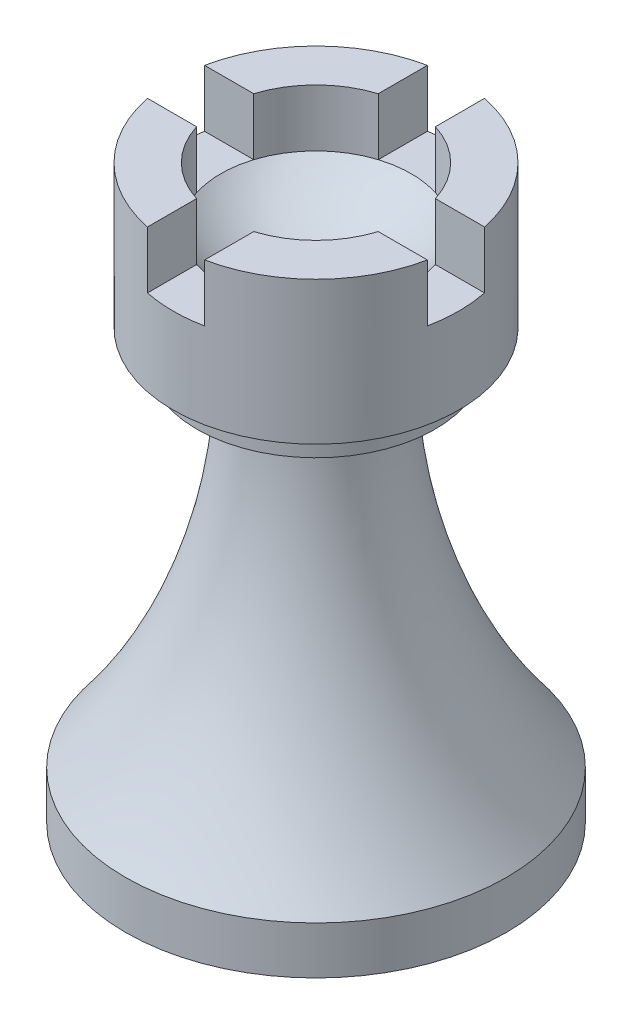
ISO-10303-21;
HEADER;
FILE_DESCRIPTION(('STEP AP214'),'2;1');
FILE_NAME('part.step','',(''),(''),'','','');
FILE_SCHEMA(('AUTOMOTIVE_DESIGN { 1 0 10303 214 1 1 1 1 }'));
ENDSEC;
DATA;
#1=APPLICATION_CONTEXT('core data for automotive mechanical design processes');
#2=APPLICATION_PROTOCOL_DEFINITION('international standard','automotive_design',2000,#1);
#3=PRODUCT_CONTEXT('',#1,'mechanical');
#4=PRODUCT('Part','Part','',(#3));
#5=PRODUCT_RELATED_PRODUCT_CATEGORY('part','',(#4));
#6=PRODUCT_DEFINITION_FORMATION('','',#4);
#7=PRODUCT_DEFINITION_CONTEXT('part definition',#1,'design');
#8=PRODUCT_DEFINITION('design','',#6,#7);
#9=PRODUCT_DEFINITION_SHAPE('','',#8);
#10=(LENGTH_UNIT() NAMED_UNIT(*) SI_UNIT(.MILLI.,.METRE.));
#11=(NAMED_UNIT(*) PLANE_ANGLE_UNIT() SI_UNIT($,.RADIAN.));
#12=(NAMED_UNIT(*) SI_UNIT($,.STERADIAN.) SOLID_ANGLE_UNIT());
#13=UNCERTAINTY_MEASURE_WITH_UNIT(LENGTH_MEASURE(1.E-05),#10,'distance_accuracy_value','');
#14=(GEOMETRIC_REPRESENTATION_CONTEXT(3) GLOBAL_UNCERTAINTY_ASSIGNED_CONTEXT((#13)) GLOBAL_UNIT_ASSIGNED_CONTEXT((#10,
#11,#12)) REPRESENTATION_CONTEXT('',''));
#15=CARTESIAN_POINT('',(0.,0.,0.));
#16=DIRECTION('',(0.,0.,1.));
#17=DIRECTION('',(1.,0.,0.));
#18=AXIS2_PLACEMENT_3D('',#15,#16,#17);
#19=CARTESIAN_POINT('',(0.,27.9733746130031,0.));
#20=DIRECTION('',(0.,1.,0.));
#21=DIRECTION('',(0.,0.,1.));
#22=AXIS2_PLACEMENT_3D('',#19,#20,#21);
#23=CYLINDRICAL_SURFACE('',#22,6.);
#24=CARTESIAN_POINT('',(0.,10.8,0.));
#25=DIRECTION('',(0.,1.,0.));
#26=DIRECTION('',(0.,0.,1.));
#27=AXIS2_PLACEMENT_3D('',#24,#25,#26);
#28=CIRCLE('',#27,6.);
#29=CARTESIAN_POINT('',(1.8,10.8,5.72363520850167));
#30=VERTEX_POINT('',#29);
#31=CARTESIAN_POINT('',(5.72363520850169,10.8,1.79999999999994));
#32=VERTEX_POINT('',#31);
#33=EDGE_CURVE('E195',#30,#32,#28,.T.);
#34=ORIENTED_EDGE('',*,*,#33,.T.);
#35=DIRECTION('',(0.,1.,0.));
#36=VECTOR('',#35,1.);
#37=CARTESIAN_POINT('',(5.72363520850169,27.9733746130031,1.79999999999994));
#38=LINE('',#37,#36);
#39=CARTESIAN_POINT('',(5.72363520850169,7.2,1.79999999999994));
#40=VERTEX_POINT('',#39);
#41=EDGE_CURVE('E560',#40,#32,#38,.T.);
#42=ORIENTED_EDGE('',*,*,#41,.F.);
#43=CARTESIAN_POINT('',(0.,7.19999999999999,0.));
#44=DIRECTION('',(0.,1.,0.));
#45=DIRECTION('',(0.,0.,1.));
#46=AXIS2_PLACEMENT_3D('',#43,#44,#45);
#47=CIRCLE('',#46,6.);
#48=CARTESIAN_POINT('',(1.8,7.2,5.72363520850167));
#49=VERTEX_POINT('',#48);
#50=EDGE_CURVE('E342',#49,#40,#47,.T.);
#51=ORIENTED_EDGE('',*,*,#50,.F.);
#52=DIRECTION('',(0.,1.,0.));
#53=VECTOR('',#52,1.);
#54=CARTESIAN_POINT('',(1.8,27.9733746130031,5.72363520850167));
#55=LINE('',#54,#53);
#56=EDGE_CURVE('E231',#30,#49,#55,.F.);
#57=ORIENTED_EDGE('',*,*,#56,.F.);
#58=EDGE_LOOP('',(#34,#42,#51,#57));
#59=FACE_BOUND('',#58,.T.);
#60=ADVANCED_FACE('F39',(#59),#23,.F.);
#61=CARTESIAN_POINT('',(9.,10.8,0.));
#62=DIRECTION('',(0.,-1.,0.));
#63=DIRECTION('',(0.,0.,-1.));
#64=AXIS2_PLACEMENT_3D('',#61,#62,#63);
#65=PLANE('',#64);
#66=CARTESIAN_POINT('',(0.,10.8,0.));
#67=DIRECTION('',(0.,1.,0.));
#68=DIRECTION('',(0.,0.,1.));
#69=AXIS2_PLACEMENT_3D('',#66,#67,#68);
#70=CIRCLE('',#69,9.);
#71=CARTESIAN_POINT('',(1.8,10.8,8.81816307401944));
#72=VERTEX_POINT('',#71);
#73=CARTESIAN_POINT('',(8.81816307401946,10.8,1.79999999999991));
#74=VERTEX_POINT('',#73);
#75=EDGE_CURVE('E180',#72,#74,#70,.T.);
#76=ORIENTED_EDGE('',*,*,#75,.T.);
#77=DIRECTION('',(1.,0.,0.));
#78=VECTOR('',#77,1.);
#79=CARTESIAN_POINT('',(12.0006000000002,10.8,1.79999999999987));
#80=LINE('',#79,#78);
#81=EDGE_CURVE('E565',#32,#74,#80,.T.);
#82=ORIENTED_EDGE('',*,*,#81,.F.);
#83=ORIENTED_EDGE('',*,*,#33,.F.);
#84=DIRECTION('',(0.,0.,-1.));
#85=VECTOR('',#84,1.);
#86=CARTESIAN_POINT('',(1.8,10.8,12.0006));
#87=LINE('',#86,#85);
#88=EDGE_CURVE('E229',#72,#30,#87,.T.);
#89=ORIENTED_EDGE('',*,*,#88,.F.);
#90=EDGE_LOOP('',(#76,#82,#83,#89));
#91=FACE_BOUND('',#90,.T.);
#92=ADVANCED_FACE('F301',(#91),#65,.F.);
#93=CARTESIAN_POINT('',(-5.72363520850167,10.8,1.80000000000002));
#94=VERTEX_POINT('',#93);
#95=CARTESIAN_POINT('',(-1.8,10.8,5.72363520850167));
#96=VERTEX_POINT('',#95);
#97=EDGE_CURVE('E341',#94,#96,#28,.T.);
#98=ORIENTED_EDGE('',*,*,#97,.T.);
#99=DIRECTION('',(0.,1.,0.));
#100=VECTOR('',#99,1.);
#101=CARTESIAN_POINT('',(-1.8,27.9733746130031,5.72363520850167));
#102=LINE('',#101,#100);
#103=CARTESIAN_POINT('',(-1.8,7.2,5.72363520850167));
#104=VERTEX_POINT('',#103);
#105=EDGE_CURVE('E216',#104,#96,#102,.T.);
#106=ORIENTED_EDGE('',*,*,#105,.F.);
#107=CARTESIAN_POINT('',(-5.72363520850167,7.2,1.80000000000002));
#108=VERTEX_POINT('',#107);
#109=EDGE_CURVE('E569',#108,#104,#47,.T.);
#110=ORIENTED_EDGE('',*,*,#109,.F.);
#111=DIRECTION('',(0.,1.,0.));
#112=VECTOR('',#111,1.);
#113=CARTESIAN_POINT('',(-5.72363520850167,27.9733746130031,1.80000000000002));
#114=LINE('',#113,#112);
#115=EDGE_CURVE('E252',#94,#108,#114,.F.);
#116=ORIENTED_EDGE('',*,*,#115,.F.);
#117=EDGE_LOOP('',(#98,#106,#110,#116));
#118=FACE_BOUND('',#117,.T.);
#119=ADVANCED_FACE('F304',(#118),#23,.F.);
#120=CARTESIAN_POINT('',(-8.81816307401943,10.8,1.80000000000003));
#121=VERTEX_POINT('',#120);
#122=CARTESIAN_POINT('',(-1.8,10.8,8.81816307401944));
#123=VERTEX_POINT('',#122);
#124=EDGE_CURVE('E185',#121,#123,#70,.T.);
#125=ORIENTED_EDGE('',*,*,#124,.T.);
#126=DIRECTION('',(0.,0.,1.));
#127=VECTOR('',#126,1.);
#128=CARTESIAN_POINT('',(-1.8,10.8,12.0006));
#129=LINE('',#128,#127);
#130=EDGE_CURVE('E204',#96,#123,#129,.T.);
#131=ORIENTED_EDGE('',*,*,#130,.F.);
#132=ORIENTED_EDGE('',*,*,#97,.F.);
#133=DIRECTION('',(1.,0.,0.));
#134=VECTOR('',#133,1.);
#135=CARTESIAN_POINT('',(-12.0006,10.8,1.80000000000004));
#136=LINE('',#135,#134);
#137=EDGE_CURVE('E206',#121,#94,#136,.T.);
#138=ORIENTED_EDGE('',*,*,#137,.F.);
#139=EDGE_LOOP('',(#125,#131,#132,#138));
#140=FACE_BOUND('',#139,.T.);
#141=ADVANCED_FACE('F202',(#140),#65,.F.);
#142=CARTESIAN_POINT('',(-1.8,10.8,-5.72363520850167));
#143=VERTEX_POINT('',#142);
#144=CARTESIAN_POINT('',(-5.72363520850168,10.8,-1.79999999999998));
#145=VERTEX_POINT('',#144);
#146=EDGE_CURVE('E196',#143,#145,#28,.T.);
#147=ORIENTED_EDGE('',*,*,#146,.T.);
#148=DIRECTION('',(0.,1.,0.));
#149=VECTOR('',#148,1.);
#150=CARTESIAN_POINT('',(-5.72363520850168,27.9733746130031,-1.79999999999998));
#151=LINE('',#150,#149);
#152=CARTESIAN_POINT('',(-5.72363520850168,7.2,-1.79999999999998));
#153=VERTEX_POINT('',#152);
#154=EDGE_CURVE('E244',#153,#145,#151,.T.);
#155=ORIENTED_EDGE('',*,*,#154,.F.);
#156=CARTESIAN_POINT('',(-1.8,7.2,-5.72363520850167));
#157=VERTEX_POINT('',#156);
#158=EDGE_CURVE('E348',#157,#153,#47,.T.);
#159=ORIENTED_EDGE('',*,*,#158,.F.);
#160=DIRECTION('',(0.,1.,0.));
#161=VECTOR('',#160,1.);
#162=CARTESIAN_POINT('',(-1.8,27.9733746130031,-5.72363520850167));
#163=LINE('',#162,#161);
#164=EDGE_CURVE('E272',#143,#157,#163,.F.);
#165=ORIENTED_EDGE('',*,*,#164,.F.);
#166=EDGE_LOOP('',(#147,#155,#159,#165));
#167=FACE_BOUND('',#166,.T.);
#168=ADVANCED_FACE('F315',(#167),#23,.F.);
#169=CARTESIAN_POINT('',(-1.8,10.8,-8.81816307401944));
#170=VERTEX_POINT('',#169);
#171=CARTESIAN_POINT('',(-8.81816307401945,10.8,-1.79999999999997));
#172=VERTEX_POINT('',#171);
#173=EDGE_CURVE('E183',#170,#172,#70,.T.);
#174=ORIENTED_EDGE('',*,*,#173,.T.);
#175=DIRECTION('',(-1.,0.,0.));
#176=VECTOR('',#175,1.);
#177=CARTESIAN_POINT('',(-12.0006000000001,10.8,-1.79999999999996));
#178=LINE('',#177,#176);
#179=EDGE_CURVE('E242',#145,#172,#178,.T.);
#180=ORIENTED_EDGE('',*,*,#179,.F.);
#181=ORIENTED_EDGE('',*,*,#146,.F.);
#182=DIRECTION('',(0.,0.,1.));
#183=VECTOR('',#182,1.);
#184=CARTESIAN_POINT('',(-1.8,10.8,-12.0006));
#185=LINE('',#184,#183);
#186=EDGE_CURVE('E270',#170,#143,#185,.T.);
#187=ORIENTED_EDGE('',*,*,#186,.F.);
#188=EDGE_LOOP('',(#174,#180,#181,#187));
#189=FACE_BOUND('',#188,.T.);
#190=ADVANCED_FACE('F323',(#189),#65,.F.);
#191=CARTESIAN_POINT('',(0.,-0.204926779867239,0.));
#192=DIRECTION('',(0.,1.,0.));
#193=DIRECTION('',(0.,0.,1.));
#194=AXIS2_PLACEMENT_3D('',#191,#192,#193);
#195=TOROIDAL_SURFACE('',#194,40.4994167315929,36.);
#196=CARTESIAN_POINT('',(0.,-1.23431286965975,0.));
#197=DIRECTION('',(0.,1.,0.));
#198=DIRECTION('',(0.,0.,1.));
#199=AXIS2_PLACEMENT_3D('',#196,#197,#198);
#200=CIRCLE('',#199,4.5141369038892);
#201=CARTESIAN_POINT('',(0.,-1.23431286965975,4.5141369038892));
#202=VERTEX_POINT('',#201);
#203=EDGE_CURVE('E11',#202,#202,#200,.F.);
#204=ORIENTED_EDGE('',*,*,#203,.T.);
#205=EDGE_LOOP('',(#204));
#206=FACE_BOUND('',#205,.T.);
#207=CARTESIAN_POINT('',(0.,-22.2,0.));
#208=DIRECTION('',(0.,1.,0.));
#209=DIRECTION('',(0.,0.,1.));
#210=AXIS2_PLACEMENT_3D('',#207,#208,#209);
#211=CIRCLE('',#210,12.);
#212=CARTESIAN_POINT('',(0.,-22.2,12.));
#213=VERTEX_POINT('',#212);
#214=EDGE_CURVE('E351',#213,#213,#211,.T.);
#215=ORIENTED_EDGE('',*,*,#214,.T.);
#216=EDGE_LOOP('',(#215));
#217=FACE_BOUND('',#216,.T.);
#218=ADVANCED_FACE('F333',(#206,#217),#195,.F.);
#219=CARTESIAN_POINT('',(0.,27.9733746130031,0.));
#220=DIRECTION('',(0.,1.,0.));
#221=DIRECTION('',(0.,0.,1.));
#222=AXIS2_PLACEMENT_3D('',#219,#220,#221);
#223=CYLINDRICAL_SURFACE('',#222,12.);
#224=ORIENTED_EDGE('',*,*,#214,.F.);
#225=EDGE_LOOP('',(#224));
#226=FACE_BOUND('',#225,.T.);
#227=CARTESIAN_POINT('',(0.,-25.2,0.));
#228=DIRECTION('',(0.,1.,0.));
#229=DIRECTION('',(0.,0.,1.));
#230=AXIS2_PLACEMENT_3D('',#227,#228,#229);
#231=CIRCLE('',#230,12.);
#232=CARTESIAN_POINT('',(0.,-25.2,12.));
#233=VERTEX_POINT('',#232);
#234=EDGE_CURVE('E347',#233,#233,#231,.T.);
#235=ORIENTED_EDGE('',*,*,#234,.T.);
#236=EDGE_LOOP('',(#235));
#237=FACE_BOUND('',#236,.T.);
#238=ADVANCED_FACE('F358',(#226,#237),#223,.T.);
#239=CARTESIAN_POINT('',(12.,-25.2,0.));
#240=DIRECTION('',(0.,1.,0.));
#241=DIRECTION('',(0.,0.,1.));
#242=AXIS2_PLACEMENT_3D('',#239,#240,#241);
#243=PLANE('',#242);
#244=ORIENTED_EDGE('',*,*,#234,.F.);
#245=EDGE_LOOP('',(#244));
#246=FACE_BOUND('',#245,.T.);
#247=ADVANCED_FACE('F324',(#246),#243,.F.);
#248=CARTESIAN_POINT('',(0.,14.3933471191217,-0.35733884764869));
#249=DIRECTION('',(-1.,0.,0.));
#250=DIRECTION('',(0.,0.,1.));
#251=AXIS2_PLACEMENT_3D('',#248,#249,#250);
#252=CIRCLE('',#251,9.6);
#253=TRIMMED_CURVE('',#252,(PARAMETER_VALUE(-1.53356492921001)),
(PARAMETER_VALUE(1.53356492921001)),.T.,.PARAMETER.);
#254=CARTESIAN_POINT('',(0.,14.3933471191217,0.));
#255=DIRECTION('',(0.,1.,0.));
#256=AXIS1_PLACEMENT('',#254,#255);
#257=SURFACE_OF_REVOLUTION('',#253,#256);
#258=CARTESIAN_POINT('',(0.,4.8,0.));
#259=VERTEX_POINT('',#258);
#260=VERTEX_LOOP('',#259);
#261=FACE_BOUND('',#260,.T.);
#262=CARTESIAN_POINT('',(1.8,7.2,-5.72363520850167));
#263=VERTEX_POINT('',#262);
#264=EDGE_CURVE('E344',#263,#157,#47,.T.);
#265=ORIENTED_EDGE('',*,*,#264,.T.);
#266=ORIENTED_EDGE('',*,*,#158,.T.);
#267=CARTESIAN_POINT('',(0.,7.19999999999999,0.));
#268=DIRECTION('',(0.,1.,0.));
#269=DIRECTION('',(0.,0.,1.));
#270=AXIS2_PLACEMENT_3D('',#267,#268,#269);
#271=CIRCLE('',#270,6.);
#272=EDGE_CURVE('E234',#153,#108,#271,.T.);
#273=ORIENTED_EDGE('',*,*,#272,.T.);
#274=ORIENTED_EDGE('',*,*,#109,.T.);
#275=CARTESIAN_POINT('',(0.,7.19999999999999,0.));
#276=DIRECTION('',(0.,1.,0.));
#277=DIRECTION('',(0.,0.,1.));
#278=AXIS2_PLACEMENT_3D('',#275,#276,#277);
#279=CIRCLE('',#278,6.);
#280=EDGE_CURVE('E218',#104,#49,#279,.T.);
#281=ORIENTED_EDGE('',*,*,#280,.T.);
#282=ORIENTED_EDGE('',*,*,#50,.T.);
#283=CARTESIAN_POINT('',(0.,7.19999999999999,0.));
#284=DIRECTION('',(0.,1.,0.));
#285=DIRECTION('',(0.,0.,1.));
#286=AXIS2_PLACEMENT_3D('',#283,#284,#285);
#287=CIRCLE('',#286,6.);
#288=CARTESIAN_POINT('',(5.72363520850165,7.2,-1.80000000000006));
#289=VERTEX_POINT('',#288);
#290=EDGE_CURVE('E553',#40,#289,#287,.T.);
#291=ORIENTED_EDGE('',*,*,#290,.T.);
#292=EDGE_CURVE('E340',#289,#263,#47,.T.);
#293=ORIENTED_EDGE('',*,*,#292,.T.);
#294=EDGE_LOOP('',(#265,#266,#273,#274,#281,#282,#291,#293));
#295=FACE_BOUND('',#294,.T.);
#296=ADVANCED_FACE('F317',(#261,#295),#257,.F.);
#297=ORIENTED_EDGE('',*,*,#292,.F.);
#298=DIRECTION('',(0.,1.,0.));
#299=VECTOR('',#298,1.);
#300=CARTESIAN_POINT('',(5.72363520850165,27.9733746130031,-1.80000000000006));
#301=LINE('',#300,#299);
#302=CARTESIAN_POINT('',(5.72363520850166,10.8,-1.80000000000006));
#303=VERTEX_POINT('',#302);
#304=EDGE_CURVE('E172',#303,#289,#301,.F.);
#305=ORIENTED_EDGE('',*,*,#304,.F.);
#306=CARTESIAN_POINT('',(1.8,10.8,-5.72363520850167));
#307=VERTEX_POINT('',#306);
#308=EDGE_CURVE('E171',#303,#307,#28,.T.);
#309=ORIENTED_EDGE('',*,*,#308,.T.);
#310=DIRECTION('',(0.,1.,0.));
#311=VECTOR('',#310,1.);
#312=CARTESIAN_POINT('',(1.8,27.9733746130031,-5.72363520850167));
#313=LINE('',#312,#311);
#314=EDGE_CURVE('E260',#263,#307,#313,.T.);
#315=ORIENTED_EDGE('',*,*,#314,.F.);
#316=EDGE_LOOP('',(#297,#305,#309,#315));
#317=FACE_BOUND('',#316,.T.);
#318=ADVANCED_FACE('F305',(#317),#23,.F.);
#319=ORIENTED_EDGE('',*,*,#308,.F.);
#320=DIRECTION('',(-1.,0.,0.));
#321=VECTOR('',#320,1.);
#322=CARTESIAN_POINT('',(12.0006000000001,10.8,-1.80000000000013));
#323=LINE('',#322,#321);
#324=CARTESIAN_POINT('',(8.81816307401942,10.8,-1.80000000000009));
#325=VERTEX_POINT('',#324);
#326=EDGE_CURVE('E158',#325,#303,#323,.T.);
#327=ORIENTED_EDGE('',*,*,#326,.F.);
#328=CARTESIAN_POINT('',(1.8,10.8,-8.81816307401944));
#329=VERTEX_POINT('',#328);
#330=EDGE_CURVE('E169',#325,#329,#70,.T.);
#331=ORIENTED_EDGE('',*,*,#330,.T.);
#332=DIRECTION('',(0.,0.,-1.));
#333=VECTOR('',#332,1.);
#334=CARTESIAN_POINT('',(1.8,10.8,-12.0006));
#335=LINE('',#334,#333);
#336=EDGE_CURVE('E258',#307,#329,#335,.T.);
#337=ORIENTED_EDGE('',*,*,#336,.F.);
#338=EDGE_LOOP('',(#319,#327,#331,#337));
#339=FACE_BOUND('',#338,.T.);
#340=ADVANCED_FACE('F167',(#339),#65,.F.);
#341=CARTESIAN_POINT('',(0.,27.9733746130031,0.));
#342=DIRECTION('',(0.,1.,0.));
#343=DIRECTION('',(0.,0.,1.));
#344=AXIS2_PLACEMENT_3D('',#341,#342,#343);
#345=CYLINDRICAL_SURFACE('',#344,9.);
#346=CARTESIAN_POINT('',(0.,7.2,0.));
#347=DIRECTION('',(0.,-1.,0.));
#348=DIRECTION('',(0.,0.,-1.));
#349=AXIS2_PLACEMENT_3D('',#346,#347,#348);
#350=CIRCLE('',#349,9.);
#351=CARTESIAN_POINT('',(8.81816307401946,7.2,1.79999999999991));
#352=VERTEX_POINT('',#351);
#353=CARTESIAN_POINT('',(8.81816307401942,7.20000000000001,-1.80000000000009));
#354=VERTEX_POINT('',#353);
#355=EDGE_CURVE('E54',#352,#354,#350,.F.);
#356=ORIENTED_EDGE('',*,*,#355,.F.);
#357=DIRECTION('',(0.,1.,0.));
#358=VECTOR('',#357,1.);
#359=CARTESIAN_POINT('',(8.81816307401946,27.9733746130031,1.79999999999991));
#360=LINE('',#359,#358);
#361=EDGE_CURVE('E585',#74,#352,#360,.F.);
#362=ORIENTED_EDGE('',*,*,#361,.F.);
#363=ORIENTED_EDGE('',*,*,#75,.F.);
#364=DIRECTION('',(0.,1.,0.));
#365=VECTOR('',#364,1.);
#366=CARTESIAN_POINT('',(1.8,27.9733746130031,8.81816307401944));
#367=LINE('',#366,#365);
#368=CARTESIAN_POINT('',(1.8,7.20000000000001,8.81816307401944));
#369=VERTEX_POINT('',#368);
#370=EDGE_CURVE('E226',#369,#72,#367,.T.);
#371=ORIENTED_EDGE('',*,*,#370,.F.);
#372=CARTESIAN_POINT('',(0.,7.2,0.));
#373=DIRECTION('',(0.,-1.,0.));
#374=DIRECTION('',(0.,0.,-1.));
#375=AXIS2_PLACEMENT_3D('',#372,#373,#374);
#376=CIRCLE('',#375,9.);
#377=CARTESIAN_POINT('',(-1.8,7.2,8.81816307401944));
#378=VERTEX_POINT('',#377);
#379=EDGE_CURVE('E62',#378,#369,#376,.F.);
#380=ORIENTED_EDGE('',*,*,#379,.F.);
#381=DIRECTION('',(0.,1.,0.));
#382=VECTOR('',#381,1.);
#383=CARTESIAN_POINT('',(-1.8,27.9733746130031,8.81816307401944));
#384=LINE('',#383,#382);
#385=EDGE_CURVE('E212',#123,#378,#384,.F.);
#386=ORIENTED_EDGE('',*,*,#385,.F.);
#387=ORIENTED_EDGE('',*,*,#124,.F.);
#388=DIRECTION('',(0.,1.,0.));
#389=VECTOR('',#388,1.);
#390=CARTESIAN_POINT('',(-8.81816307401943,27.9733746130031,1.80000000000003));
#391=LINE('',#390,#389);
#392=CARTESIAN_POINT('',(-8.81816307401943,7.20000000000001,1.80000000000003));
#393=VERTEX_POINT('',#392);
#394=EDGE_CURVE('E210',#393,#121,#391,.T.);
#395=ORIENTED_EDGE('',*,*,#394,.F.);
#396=CARTESIAN_POINT('',(0.,7.2,0.));
#397=DIRECTION('',(0.,-1.,0.));
#398=DIRECTION('',(0.,0.,-1.));
#399=AXIS2_PLACEMENT_3D('',#396,#397,#398);
#400=CIRCLE('',#399,9.);
#401=CARTESIAN_POINT('',(-8.81816307401945,7.2,-1.79999999999997));
#402=VERTEX_POINT('',#401);
#403=EDGE_CURVE('E237',#402,#393,#400,.F.);
#404=ORIENTED_EDGE('',*,*,#403,.F.);
#405=DIRECTION('',(0.,1.,0.));
#406=VECTOR('',#405,1.);
#407=CARTESIAN_POINT('',(-8.81816307401945,27.9733746130031,-1.79999999999997));
#408=LINE('',#407,#406);
#409=EDGE_CURVE('E239',#172,#402,#408,.F.);
#410=ORIENTED_EDGE('',*,*,#409,.F.);
#411=ORIENTED_EDGE('',*,*,#173,.F.);
#412=DIRECTION('',(0.,1.,0.));
#413=VECTOR('',#412,1.);
#414=CARTESIAN_POINT('',(-1.8,27.9733746130031,-8.81816307401944));
#415=LINE('',#414,#413);
#416=CARTESIAN_POINT('',(-1.8,7.20000000000001,-8.81816307401944));
#417=VERTEX_POINT('',#416);
#418=EDGE_CURVE('E267',#417,#170,#415,.T.);
#419=ORIENTED_EDGE('',*,*,#418,.F.);
#420=CARTESIAN_POINT('',(0.,7.2,0.));
#421=DIRECTION('',(0.,-1.,0.));
#422=DIRECTION('',(0.,0.,-1.));
#423=AXIS2_PLACEMENT_3D('',#420,#421,#422);
#424=CIRCLE('',#423,9.);
#425=CARTESIAN_POINT('',(1.8,7.2,-8.81816307401944));
#426=VERTEX_POINT('',#425);
#427=EDGE_CURVE('E255',#426,#417,#424,.F.);
#428=ORIENTED_EDGE('',*,*,#427,.F.);
#429=DIRECTION('',(0.,1.,0.));
#430=VECTOR('',#429,1.);
#431=CARTESIAN_POINT('',(1.8,27.9733746130031,-8.81816307401944));
#432=LINE('',#431,#430);
#433=EDGE_CURVE('E179',#329,#426,#432,.F.);
#434=ORIENTED_EDGE('',*,*,#433,.F.);
#435=ORIENTED_EDGE('',*,*,#330,.F.);
#436=DIRECTION('',(0.,1.,0.));
#437=VECTOR('',#436,1.);
#438=CARTESIAN_POINT('',(8.81816307401942,27.9733746130031,-1.80000000000009));
#439=LINE('',#438,#437);
#440=EDGE_CURVE('E154',#354,#325,#439,.T.);
#441=ORIENTED_EDGE('',*,*,#440,.F.);
#442=EDGE_LOOP('',(#356,#362,#363,#371,#380,#386,#387,#395,#404,#410,#411,#419,#428,#434,#435,#441));
#443=FACE_BOUND('',#442,.T.);
#444=CARTESIAN_POINT('',(0.,1.8,0.));
#445=DIRECTION('',(0.,1.,0.));
#446=DIRECTION('',(0.,0.,1.));
#447=AXIS2_PLACEMENT_3D('',#444,#445,#446);
#448=CIRCLE('',#447,9.);
#449=CARTESIAN_POINT('',(0.,1.8,9.));
#450=VERTEX_POINT('',#449);
#451=EDGE_CURVE('E181',#450,#450,#448,.T.);
#452=ORIENTED_EDGE('',*,*,#451,.T.);
#453=EDGE_LOOP('',(#452));
#454=FACE_BOUND('',#453,.T.);
#455=ADVANCED_FACE('F175',(#443,#454),#345,.T.);
#456=CARTESIAN_POINT('',(7.5,1.8,0.));
#457=DIRECTION('',(0.,1.,0.));
#458=DIRECTION('',(0.,0.,1.));
#459=AXIS2_PLACEMENT_3D('',#456,#457,#458);
#460=PLANE('',#459);
#461=ORIENTED_EDGE('',*,*,#451,.F.);
#462=EDGE_LOOP('',(#461));
#463=FACE_BOUND('',#462,.T.);
#464=CARTESIAN_POINT('',(0.,1.8,0.));
#465=DIRECTION('',(0.,1.,0.));
#466=DIRECTION('',(0.,0.,1.));
#467=AXIS2_PLACEMENT_3D('',#464,#465,#466);
#468=CIRCLE('',#467,7.5);
#469=CARTESIAN_POINT('',(0.,1.8,7.5));
#470=VERTEX_POINT('',#469);
#471=EDGE_CURVE('E187',#470,#470,#468,.T.);
#472=ORIENTED_EDGE('',*,*,#471,.T.);
#473=EDGE_LOOP('',(#472));
#474=FACE_BOUND('',#473,.T.);
#475=ADVANCED_FACE('F281',(#463,#474),#460,.F.);
#476=CARTESIAN_POINT('',(0.,27.9733746130031,0.));
#477=DIRECTION('',(0.,1.,0.));
#478=DIRECTION('',(0.,0.,1.));
#479=AXIS2_PLACEMENT_3D('',#476,#477,#478);
#480=CYLINDRICAL_SURFACE('',#479,7.5);
#481=ORIENTED_EDGE('',*,*,#471,.F.);
#482=EDGE_LOOP('',(#481));
#483=FACE_BOUND('',#482,.T.);
#484=CARTESIAN_POINT('',(0.,0.,0.));
#485=DIRECTION('',(0.,1.,0.));
#486=DIRECTION('',(0.,0.,1.));
#487=AXIS2_PLACEMENT_3D('',#484,#485,#486);
#488=CIRCLE('',#487,7.5);
#489=CARTESIAN_POINT('',(0.,0.,7.5));
#490=VERTEX_POINT('',#489);
#491=EDGE_CURVE('E275',#490,#490,#488,.T.);
#492=ORIENTED_EDGE('',*,*,#491,.T.);
#493=EDGE_LOOP('',(#492));
#494=FACE_BOUND('',#493,.T.);
#495=ADVANCED_FACE('F283',(#483,#494),#480,.T.);
#496=CARTESIAN_POINT('',(4.5,0.,0.));
#497=DIRECTION('',(0.,1.,0.));
#498=DIRECTION('',(0.,0.,1.));
#499=AXIS2_PLACEMENT_3D('',#496,#497,#498);
#500=PLANE('',#499);
#501=CARTESIAN_POINT('',(0.,0.,0.));
#502=DIRECTION('',(0.,1.,0.));
#503=DIRECTION('',(0.,0.,1.));
#504=AXIS2_PLACEMENT_3D('',#501,#502,#503);
#505=CIRCLE('',#504,5.71364623147932);
#506=CARTESIAN_POINT('',(0.,0.,5.71364623147932));
#507=VERTEX_POINT('',#506);
#508=EDGE_CURVE('E47',#507,#507,#505,.T.);
#509=ORIENTED_EDGE('',*,*,#508,.T.);
#510=EDGE_LOOP('',(#509));
#511=FACE_BOUND('',#510,.T.);
#512=ORIENTED_EDGE('',*,*,#491,.F.);
#513=EDGE_LOOP('',(#512));
#514=FACE_BOUND('',#513,.T.);
#515=ADVANCED_FACE('F286',(#511,#514),#500,.F.);
#516=CARTESIAN_POINT('',(0.,-1.2,0.));
#517=DIRECTION('',(0.,-1.,0.));
#518=DIRECTION('',(0.,0.,-1.));
#519=AXIS2_PLACEMENT_3D('',#516,#517,#518);
#520=TOROIDAL_SURFACE('',#519,5.71364623147932,1.2);
#521=ORIENTED_EDGE('',*,*,#203,.F.);
#522=EDGE_LOOP('',(#521));
#523=FACE_BOUND('',#522,.T.);
#524=ORIENTED_EDGE('',*,*,#508,.F.);
#525=EDGE_LOOP('',(#524));
#526=FACE_BOUND('',#525,.T.);
#527=ADVANCED_FACE('F41',(#523,#526),#520,.F.);
#528=CARTESIAN_POINT('',(1.8,14.4,-12.0006));
#529=DIRECTION('',(1.,0.,0.));
#530=DIRECTION('',(0.,1.,0.));
#531=AXIS2_PLACEMENT_3D('',#528,#529,#530);
#532=PLANE('',#531);
#533=ORIENTED_EDGE('',*,*,#314,.T.);
#534=ORIENTED_EDGE('',*,*,#336,.T.);
#535=ORIENTED_EDGE('',*,*,#433,.T.);
#536=DIRECTION('',(0.,0.,1.));
#537=VECTOR('',#536,1.);
#538=CARTESIAN_POINT('',(1.8,7.2,-12.0006));
#539=LINE('',#538,#537);
#540=EDGE_CURVE('E264',#426,#263,#539,.T.);
#541=ORIENTED_EDGE('',*,*,#540,.T.);
#542=EDGE_LOOP('',(#533,#534,#535,#541));
#543=FACE_BOUND('',#542,.T.);
#544=ADVANCED_FACE('F296',(#543),#532,.F.);
#545=CARTESIAN_POINT('',(-1.8,7.2,-12.0006));
#546=DIRECTION('',(0.,-1.,0.));
#547=DIRECTION('',(0.,0.,-1.));
#548=AXIS2_PLACEMENT_3D('',#545,#546,#547);
#549=PLANE('',#548);
#550=ORIENTED_EDGE('',*,*,#264,.F.);
#551=ORIENTED_EDGE('',*,*,#540,.F.);
#552=ORIENTED_EDGE('',*,*,#427,.T.);
#553=DIRECTION('',(0.,0.,1.));
#554=VECTOR('',#553,1.);
#555=CARTESIAN_POINT('',(-1.8,7.2,-12.0006));
#556=LINE('',#555,#554);
#557=EDGE_CURVE('E263',#417,#157,#556,.T.);
#558=ORIENTED_EDGE('',*,*,#557,.T.);
#559=EDGE_LOOP('',(#550,#551,#552,#558));
#560=FACE_BOUND('',#559,.T.);
#561=ADVANCED_FACE('F441',(#560),#549,.F.);
#562=CARTESIAN_POINT('',(-1.8,14.4,-12.0006));
#563=DIRECTION('',(-1.,0.,0.));
#564=DIRECTION('',(0.,-1.,0.));
#565=AXIS2_PLACEMENT_3D('',#562,#563,#564);
#566=PLANE('',#565);
#567=ORIENTED_EDGE('',*,*,#164,.T.);
#568=ORIENTED_EDGE('',*,*,#557,.F.);
#569=ORIENTED_EDGE('',*,*,#418,.T.);
#570=ORIENTED_EDGE('',*,*,#186,.T.);
#571=EDGE_LOOP('',(#567,#568,#569,#570));
#572=FACE_BOUND('',#571,.T.);
#573=ADVANCED_FACE('F450',(#572),#566,.F.);
#574=CARTESIAN_POINT('',(-12.0006000000001,14.4,-1.79999999999996));
#575=DIRECTION('',(0.,0.,-1.));
#576=DIRECTION('',(-1.,0.,0.));
#577=AXIS2_PLACEMENT_3D('',#574,#575,#576);
#578=PLANE('',#577);
#579=ORIENTED_EDGE('',*,*,#154,.T.);
#580=ORIENTED_EDGE('',*,*,#179,.T.);
#581=ORIENTED_EDGE('',*,*,#409,.T.);
#582=DIRECTION('',(1.,0.,0.));
#583=VECTOR('',#582,1.);
#584=CARTESIAN_POINT('',(-12.0006000000001,7.2,-1.79999999999996));
#585=LINE('',#584,#583);
#586=EDGE_CURVE('E247',#402,#153,#585,.T.);
#587=ORIENTED_EDGE('',*,*,#586,.T.);
#588=EDGE_LOOP('',(#579,#580,#581,#587));
#589=FACE_BOUND('',#588,.T.);
#590=ADVANCED_FACE('F460',(#589),#578,.F.);
#591=CARTESIAN_POINT('',(-12.0006,7.2,1.80000000000004));
#592=DIRECTION('',(0.,-1.,0.));
#593=DIRECTION('',(0.,0.,-1.));
#594=AXIS2_PLACEMENT_3D('',#591,#592,#593);
#595=PLANE('',#594);
#596=ORIENTED_EDGE('',*,*,#272,.F.);
#597=ORIENTED_EDGE('',*,*,#586,.F.);
#598=ORIENTED_EDGE('',*,*,#403,.T.);
#599=DIRECTION('',(1.,0.,0.));
#600=VECTOR('',#599,1.);
#601=CARTESIAN_POINT('',(-12.0006,7.2,1.80000000000004));
#602=LINE('',#601,#600);
#603=EDGE_CURVE('E246',#393,#108,#602,.T.);
#604=ORIENTED_EDGE('',*,*,#603,.T.);
#605=EDGE_LOOP('',(#596,#597,#598,#604));
#606=FACE_BOUND('',#605,.T.);
#607=ADVANCED_FACE('F471',(#606),#595,.F.);
#608=CARTESIAN_POINT('',(-12.0006,14.4,1.80000000000004));
#609=DIRECTION('',(0.,0.,1.));
#610=DIRECTION('',(1.,0.,0.));
#611=AXIS2_PLACEMENT_3D('',#608,#609,#610);
#612=PLANE('',#611);
#613=ORIENTED_EDGE('',*,*,#115,.T.);
#614=ORIENTED_EDGE('',*,*,#603,.F.);
#615=ORIENTED_EDGE('',*,*,#394,.T.);
#616=ORIENTED_EDGE('',*,*,#137,.T.);
#617=EDGE_LOOP('',(#613,#614,#615,#616));
#618=FACE_BOUND('',#617,.T.);
#619=ADVANCED_FACE('F482',(#618),#612,.F.);
#620=CARTESIAN_POINT('',(-1.8,14.4,12.0006));
#621=DIRECTION('',(-1.,0.,0.));
#622=DIRECTION('',(0.,-1.,0.));
#623=AXIS2_PLACEMENT_3D('',#620,#621,#622);
#624=PLANE('',#623);
#625=ORIENTED_EDGE('',*,*,#105,.T.);
#626=ORIENTED_EDGE('',*,*,#130,.T.);
#627=ORIENTED_EDGE('',*,*,#385,.T.);
#628=DIRECTION('',(0.,0.,-1.));
#629=VECTOR('',#628,1.);
#630=CARTESIAN_POINT('',(-1.8,7.2,12.0006));
#631=LINE('',#630,#629);
#632=EDGE_CURVE('E224',#378,#104,#631,.T.);
#633=ORIENTED_EDGE('',*,*,#632,.T.);
#634=EDGE_LOOP('',(#625,#626,#627,#633));
#635=FACE_BOUND('',#634,.T.);
#636=ADVANCED_FACE('F492',(#635),#624,.F.);
#637=CARTESIAN_POINT('',(1.8,7.2,12.0006));
#638=DIRECTION('',(0.,-1.,0.));
#639=DIRECTION('',(0.,0.,-1.));
#640=AXIS2_PLACEMENT_3D('',#637,#638,#639);
#641=PLANE('',#640);
#642=ORIENTED_EDGE('',*,*,#280,.F.);
#643=ORIENTED_EDGE('',*,*,#632,.F.);
#644=ORIENTED_EDGE('',*,*,#379,.T.);
#645=DIRECTION('',(0.,0.,-1.));
#646=VECTOR('',#645,1.);
#647=CARTESIAN_POINT('',(1.8,7.2,12.0006));
#648=LINE('',#647,#646);
#649=EDGE_CURVE('E223',#369,#49,#648,.T.);
#650=ORIENTED_EDGE('',*,*,#649,.T.);
#651=EDGE_LOOP('',(#642,#643,#644,#650));
#652=FACE_BOUND('',#651,.T.);
#653=ADVANCED_FACE('F502',(#652),#641,.F.);
#654=CARTESIAN_POINT('',(1.8,14.4,12.0006));
#655=DIRECTION('',(1.,0.,0.));
#656=DIRECTION('',(0.,1.,0.));
#657=AXIS2_PLACEMENT_3D('',#654,#655,#656);
#658=PLANE('',#657);
#659=ORIENTED_EDGE('',*,*,#56,.T.);
#660=ORIENTED_EDGE('',*,*,#649,.F.);
#661=ORIENTED_EDGE('',*,*,#370,.T.);
#662=ORIENTED_EDGE('',*,*,#88,.T.);
#663=EDGE_LOOP('',(#659,#660,#661,#662));
#664=FACE_BOUND('',#663,.T.);
#665=ADVANCED_FACE('F511',(#664),#658,.F.);
#666=CARTESIAN_POINT('',(12.0006000000002,14.4,1.79999999999987));
#667=DIRECTION('',(0.,0.,1.));
#668=DIRECTION('',(1.,0.,0.));
#669=AXIS2_PLACEMENT_3D('',#666,#667,#668);
#670=PLANE('',#669);
#671=ORIENTED_EDGE('',*,*,#41,.T.);
#672=ORIENTED_EDGE('',*,*,#81,.T.);
#673=ORIENTED_EDGE('',*,*,#361,.T.);
#674=DIRECTION('',(-1.,0.,0.));
#675=VECTOR('',#674,1.);
#676=CARTESIAN_POINT('',(12.0006000000002,7.2,1.79999999999987));
#677=LINE('',#676,#675);
#678=EDGE_CURVE('E163',#352,#40,#677,.T.);
#679=ORIENTED_EDGE('',*,*,#678,.T.);
#680=EDGE_LOOP('',(#671,#672,#673,#679));
#681=FACE_BOUND('',#680,.T.);
#682=ADVANCED_FACE('F520',(#681),#670,.F.);
#683=CARTESIAN_POINT('',(12.0006000000001,7.2,-1.80000000000013));
#684=DIRECTION('',(0.,-1.,0.));
#685=DIRECTION('',(0.,0.,-1.));
#686=AXIS2_PLACEMENT_3D('',#683,#684,#685);
#687=PLANE('',#686);
#688=ORIENTED_EDGE('',*,*,#290,.F.);
#689=ORIENTED_EDGE('',*,*,#678,.F.);
#690=ORIENTED_EDGE('',*,*,#355,.T.);
#691=DIRECTION('',(-1.,0.,0.));
#692=VECTOR('',#691,1.);
#693=CARTESIAN_POINT('',(12.0006000000001,7.2,-1.80000000000013));
#694=LINE('',#693,#692);
#695=EDGE_CURVE('E160',#354,#289,#694,.T.);
#696=ORIENTED_EDGE('',*,*,#695,.T.);
#697=EDGE_LOOP('',(#688,#689,#690,#696));
#698=FACE_BOUND('',#697,.T.);
#699=ADVANCED_FACE('F530',(#698),#687,.F.);
#700=CARTESIAN_POINT('',(12.0006000000001,14.4,-1.80000000000013));
#701=DIRECTION('',(0.,0.,-1.));
#702=DIRECTION('',(-1.,0.,0.));
#703=AXIS2_PLACEMENT_3D('',#700,#701,#702);
#704=PLANE('',#703);
#705=ORIENTED_EDGE('',*,*,#304,.T.);
#706=ORIENTED_EDGE('',*,*,#695,.F.);
#707=ORIENTED_EDGE('',*,*,#440,.T.);
#708=ORIENTED_EDGE('',*,*,#326,.T.);
#709=EDGE_LOOP('',(#705,#706,#707,#708));
#710=FACE_BOUND('',#709,.T.);
#711=ADVANCED_FACE('F157',(#710),#704,.F.);
#712=CLOSED_SHELL('',(#60,#92,#119,#141,#168,#190,#218,#238,#247,#296,#318,#340,#455,#475,#495,
#515,#527,#544,#561,#573,#590,#607,#619,#636,#653,#665,#682,#699,#711));
#713=MANIFOLD_SOLID_BREP('B2',#712);
#714=ADVANCED_BREP_SHAPE_REPRESENTATION('',(#18,#713),#14);
#715=SHAPE_DEFINITION_REPRESENTATION(#9,#714);
ENDSEC;
END-ISO-10303-21;
